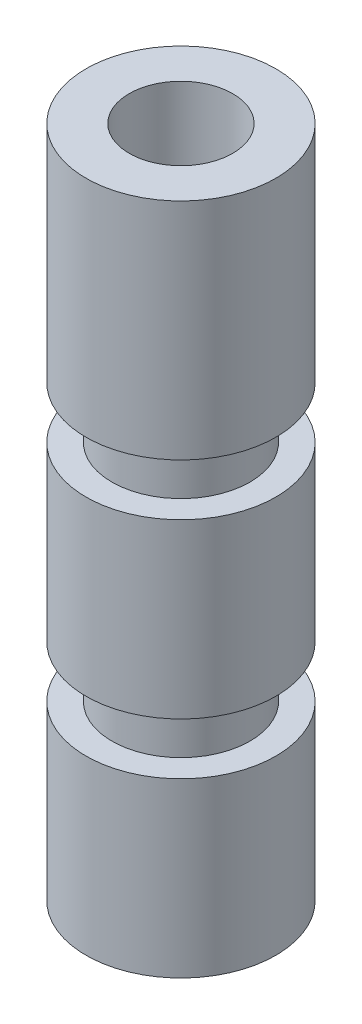
ISO-10303-21;
HEADER;
FILE_DESCRIPTION(('STEP AP214'),'2;1');
FILE_NAME('part.step','',(''),(''),'','','');
FILE_SCHEMA(('AUTOMOTIVE_DESIGN { 1 0 10303 214 1 1 1 1 }'));
ENDSEC;
DATA;
#1=APPLICATION_CONTEXT('core data for automotive mechanical design processes');
#2=APPLICATION_PROTOCOL_DEFINITION('international standard','automotive_design',2000,#1);
#3=PRODUCT_CONTEXT('',#1,'mechanical');
#4=PRODUCT('Part','Part','',(#3));
#5=PRODUCT_RELATED_PRODUCT_CATEGORY('part','',(#4));
#6=PRODUCT_DEFINITION_FORMATION('','',#4);
#7=PRODUCT_DEFINITION_CONTEXT('part definition',#1,'design');
#8=PRODUCT_DEFINITION('design','',#6,#7);
#9=PRODUCT_DEFINITION_SHAPE('','',#8);
#10=(LENGTH_UNIT() NAMED_UNIT(*) SI_UNIT(.MILLI.,.METRE.));
#11=(NAMED_UNIT(*) PLANE_ANGLE_UNIT() SI_UNIT($,.RADIAN.));
#12=(NAMED_UNIT(*) SI_UNIT($,.STERADIAN.) SOLID_ANGLE_UNIT());
#13=UNCERTAINTY_MEASURE_WITH_UNIT(LENGTH_MEASURE(1.E-05),#10,'distance_accuracy_value','');
#14=(GEOMETRIC_REPRESENTATION_CONTEXT(3) GLOBAL_UNCERTAINTY_ASSIGNED_CONTEXT((#13)) GLOBAL_UNIT_ASSIGNED_CONTEXT((#10,
#11,#12)) REPRESENTATION_CONTEXT('',''));
#15=CARTESIAN_POINT('',(0.,0.,0.));
#16=DIRECTION('',(0.,0.,1.));
#17=DIRECTION('',(1.,0.,0.));
#18=AXIS2_PLACEMENT_3D('',#15,#16,#17);
#19=CARTESIAN_POINT('',(0.,-6.5,0.));
#20=DIRECTION('',(0.,-1.,0.));
#21=DIRECTION('',(0.,0.,-1.));
#22=AXIS2_PLACEMENT_3D('',#19,#20,#21);
#23=PLANE('',#22);
#24=CARTESIAN_POINT('',(0.,-6.5,0.));
#25=DIRECTION('',(0.,-1.,0.));
#26=DIRECTION('',(0.,0.,-1.));
#27=AXIS2_PLACEMENT_3D('',#24,#25,#26);
#28=CIRCLE('',#27,2.75);
#29=CARTESIAN_POINT('',(0.,-6.5,-2.75));
#30=VERTEX_POINT('',#29);
#31=EDGE_CURVE('E65',#30,#30,#28,.T.);
#32=ORIENTED_EDGE('',*,*,#31,.T.);
#33=EDGE_LOOP('',(#32));
#34=FACE_BOUND('',#33,.T.);
#35=CARTESIAN_POINT('',(0.,-6.5,0.));
#36=DIRECTION('',(0.,-1.,0.));
#37=DIRECTION('',(0.,0.,-1.));
#38=AXIS2_PLACEMENT_3D('',#35,#36,#37);
#39=CIRCLE('',#38,2.);
#40=CARTESIAN_POINT('',(0.,-6.5,-2.));
#41=VERTEX_POINT('',#40);
#42=EDGE_CURVE('E74',#41,#41,#39,.T.);
#43=ORIENTED_EDGE('',*,*,#42,.F.);
#44=EDGE_LOOP('',(#43));
#45=FACE_BOUND('',#44,.T.);
#46=ADVANCED_FACE('F37',(#34,#45),#23,.T.);
#47=CARTESIAN_POINT('',(0.,0.,0.));
#48=DIRECTION('',(0.,1.,0.));
#49=DIRECTION('',(0.,0.,1.));
#50=AXIS2_PLACEMENT_3D('',#47,#48,#49);
#51=PLANE('',#50);
#52=CARTESIAN_POINT('',(0.,0.,0.));
#53=DIRECTION('',(0.,1.,0.));
#54=DIRECTION('',(0.,0.,1.));
#55=AXIS2_PLACEMENT_3D('',#52,#53,#54);
#56=CIRCLE('',#55,2.75);
#57=CARTESIAN_POINT('',(0.,0.,-2.75));
#58=VERTEX_POINT('',#57);
#59=EDGE_CURVE('E50',#58,#58,#56,.T.);
#60=ORIENTED_EDGE('',*,*,#59,.F.);
#61=EDGE_LOOP('',(#60));
#62=FACE_BOUND('',#61,.T.);
#63=CARTESIAN_POINT('',(0.,0.,0.));
#64=DIRECTION('',(0.,1.,0.));
#65=DIRECTION('',(0.,0.,1.));
#66=AXIS2_PLACEMENT_3D('',#63,#64,#65);
#67=CIRCLE('',#66,2.);
#68=CARTESIAN_POINT('',(0.,0.,2.));
#69=VERTEX_POINT('',#68);
#70=EDGE_CURVE('E10',#69,#69,#67,.F.);
#71=ORIENTED_EDGE('',*,*,#70,.F.);
#72=EDGE_LOOP('',(#71));
#73=FACE_BOUND('',#72,.T.);
#74=ADVANCED_FACE('F113',(#62,#73),#51,.F.);
#75=CARTESIAN_POINT('',(0.,6.5,0.));
#76=DIRECTION('',(0.,1.,0.));
#77=DIRECTION('',(0.,0.,1.));
#78=AXIS2_PLACEMENT_3D('',#75,#76,#77);
#79=PLANE('',#78);
#80=CARTESIAN_POINT('',(0.,6.5,0.));
#81=DIRECTION('',(0.,1.,0.));
#82=DIRECTION('',(0.,0.,1.));
#83=AXIS2_PLACEMENT_3D('',#80,#81,#82);
#84=CIRCLE('',#83,2.75);
#85=CARTESIAN_POINT('',(0.,6.5,-2.75));
#86=VERTEX_POINT('',#85);
#87=EDGE_CURVE('E45',#86,#86,#84,.T.);
#88=ORIENTED_EDGE('',*,*,#87,.T.);
#89=EDGE_LOOP('',(#88));
#90=FACE_BOUND('',#89,.T.);
#91=CARTESIAN_POINT('',(0.,6.5,0.));
#92=DIRECTION('',(0.,1.,0.));
#93=DIRECTION('',(0.,0.,1.));
#94=AXIS2_PLACEMENT_3D('',#91,#92,#93);
#95=CIRCLE('',#94,1.5);
#96=CARTESIAN_POINT('',(0.,6.5,-1.5));
#97=VERTEX_POINT('',#96);
#98=EDGE_CURVE('E56',#97,#97,#95,.T.);
#99=ORIENTED_EDGE('',*,*,#98,.F.);
#100=EDGE_LOOP('',(#99));
#101=FACE_BOUND('',#100,.T.);
#102=ADVANCED_FACE('F121',(#90,#101),#79,.T.);
#103=CARTESIAN_POINT('',(0.,6.5,0.));
#104=DIRECTION('',(0.,-1.,0.));
#105=DIRECTION('',(0.,0.,-1.));
#106=AXIS2_PLACEMENT_3D('',#103,#104,#105);
#107=CYLINDRICAL_SURFACE('',#106,2.75);
#108=CARTESIAN_POINT('',(0.,6.5,-2.75));
#109=CARTESIAN_POINT('',(0.,6.43229166666667,-2.75));
#110=CARTESIAN_POINT('',(0.,6.36458333333333,-2.75));
#111=CARTESIAN_POINT('',(0.,6.22916666666667,-2.75));
#112=CARTESIAN_POINT('',(0.,6.16145833333333,-2.75));
#113=CARTESIAN_POINT('',(0.,6.02604166666667,-2.75));
#114=CARTESIAN_POINT('',(0.,5.95833333333333,-2.75));
#115=CARTESIAN_POINT('',(0.,5.82291666666667,-2.75));
#116=CARTESIAN_POINT('',(0.,5.75520833333333,-2.75));
#117=CARTESIAN_POINT('',(0.,5.61979166666667,-2.75));
#118=CARTESIAN_POINT('',(0.,5.55208333333333,-2.75));
#119=CARTESIAN_POINT('',(0.,5.41666666666667,-2.75));
#120=CARTESIAN_POINT('',(0.,5.34895833333333,-2.75));
#121=CARTESIAN_POINT('',(0.,5.21354166666667,-2.75));
#122=CARTESIAN_POINT('',(0.,5.14583333333333,-2.75));
#123=CARTESIAN_POINT('',(0.,5.01041666666667,-2.75));
#124=CARTESIAN_POINT('',(0.,4.94270833333333,-2.75));
#125=CARTESIAN_POINT('',(0.,4.80729166666667,-2.75));
#126=CARTESIAN_POINT('',(0.,4.73958333333333,-2.75));
#127=CARTESIAN_POINT('',(0.,4.60416666666667,-2.75));
#128=CARTESIAN_POINT('',(0.,4.53645833333333,-2.75));
#129=CARTESIAN_POINT('',(0.,4.40104166666667,-2.75));
#130=CARTESIAN_POINT('',(0.,4.33333333333333,-2.75));
#131=CARTESIAN_POINT('',(0.,4.19791666666667,-2.75));
#132=CARTESIAN_POINT('',(0.,4.13020833333333,-2.75));
#133=CARTESIAN_POINT('',(0.,3.99479166666667,-2.75));
#134=CARTESIAN_POINT('',(0.,3.92708333333333,-2.75));
#135=CARTESIAN_POINT('',(0.,3.79166666666667,-2.75));
#136=CARTESIAN_POINT('',(0.,3.72395833333333,-2.75));
#137=CARTESIAN_POINT('',(0.,3.58854166666667,-2.75));
#138=CARTESIAN_POINT('',(0.,3.52083333333333,-2.75));
#139=CARTESIAN_POINT('',(0.,3.38541666666667,-2.75));
#140=CARTESIAN_POINT('',(0.,3.31770833333333,-2.75));
#141=CARTESIAN_POINT('',(0.,3.18229166666667,-2.75));
#142=CARTESIAN_POINT('',(0.,3.11458333333333,-2.75));
#143=CARTESIAN_POINT('',(0.,2.97916666666667,-2.75));
#144=CARTESIAN_POINT('',(0.,2.91145833333333,-2.75));
#145=CARTESIAN_POINT('',(0.,2.77604166666667,-2.75));
#146=CARTESIAN_POINT('',(0.,2.70833333333333,-2.75));
#147=CARTESIAN_POINT('',(0.,2.57291666666667,-2.75));
#148=CARTESIAN_POINT('',(0.,2.50520833333333,-2.75));
#149=CARTESIAN_POINT('',(0.,2.36979166666667,-2.75));
#150=CARTESIAN_POINT('',(0.,2.30208333333333,-2.75));
#151=CARTESIAN_POINT('',(0.,2.16666666666667,-2.75));
#152=CARTESIAN_POINT('',(0.,2.09895833333333,-2.75));
#153=CARTESIAN_POINT('',(0.,1.96354166666667,-2.75));
#154=CARTESIAN_POINT('',(0.,1.89583333333333,-2.75));
#155=CARTESIAN_POINT('',(0.,1.76041666666667,-2.75));
#156=CARTESIAN_POINT('',(0.,1.69270833333333,-2.75));
#157=CARTESIAN_POINT('',(0.,1.55729166666667,-2.75));
#158=CARTESIAN_POINT('',(0.,1.48958333333333,-2.75));
#159=CARTESIAN_POINT('',(0.,1.35416666666667,-2.75));
#160=CARTESIAN_POINT('',(0.,1.28645833333333,-2.75));
#161=CARTESIAN_POINT('',(0.,1.15104166666667,-2.75));
#162=CARTESIAN_POINT('',(0.,1.08333333333333,-2.75));
#163=CARTESIAN_POINT('',(0.,0.947916666666667,-2.75));
#164=CARTESIAN_POINT('',(0.,0.880208333333333,-2.75));
#165=CARTESIAN_POINT('',(0.,0.744791666666667,-2.75));
#166=CARTESIAN_POINT('',(0.,0.677083333333333,-2.75));
#167=CARTESIAN_POINT('',(0.,0.541666666666667,-2.75));
#168=CARTESIAN_POINT('',(0.,0.473958333333333,-2.75));
#169=CARTESIAN_POINT('',(0.,0.338541666666667,-2.75));
#170=CARTESIAN_POINT('',(0.,0.270833333333334,-2.75));
#171=CARTESIAN_POINT('',(0.,0.135416666666667,-2.75));
#172=CARTESIAN_POINT('',(0.,0.0677083333333334,-2.75));
#173=CARTESIAN_POINT('',(0.,0.,-2.75));
#174=B_SPLINE_CURVE_WITH_KNOTS('',3,(#108,#109,#110,#111,#112,#113,#114,#115,#116,#117,#118,
#119,#120,#121,#122,#123,#124,#125,#126,#127,#128,#129,#130,#131,#132,#133,#134,#135,#136,#137,
#138,#139,#140,#141,#142,#143,#144,#145,#146,#147,#148,#149,#150,#151,#152,#153,#154,#155,#156,
#157,#158,#159,#160,#161,#162,#163,#164,#165,#166,#167,#168,#169,#170,#171,#172,#173),
.UNSPECIFIED.,.F.,.F.,(4,2,2,2,2,2,2,2,2,2,2,2,2,2,2,2,2,2,2,2,2,2,2,2,2,2,2,2,2,2,2,2,4),(0.,
0.203125,0.40625,0.609375000000001,0.812500000000001,1.015625,1.21875,1.421875,1.625,1.828125,
2.03125,2.234375,2.4375,2.640625,2.84375,3.046875,3.25,3.453125,3.65625,3.859375,4.0625,
4.265625,4.46875,4.671875,4.875,5.078125,5.28125,5.484375,5.6875,5.890625,6.09375,6.296875,6.5),.UNSPECIFIED.);
#175=EDGE_CURVE('BSEAM39',#86,#58,#174,.T.);
#176=ORIENTED_EDGE('',*,*,#87,.F.);
#177=ORIENTED_EDGE('',*,*,#59,.T.);
#178=ORIENTED_EDGE('',*,*,#175,.T.);
#179=ORIENTED_EDGE('',*,*,#175,.F.);
#180=EDGE_LOOP('',(#176,#178,#177,#179));
#181=FACE_BOUND('',#180,.T.);
#182=ADVANCED_FACE('F39',(#181),#107,.T.);
#183=CARTESIAN_POINT('',(0.,6.5,0.));
#184=DIRECTION('',(0.,-1.,0.));
#185=DIRECTION('',(0.,0.,-1.));
#186=AXIS2_PLACEMENT_3D('',#183,#184,#185);
#187=CYLINDRICAL_SURFACE('',#186,1.5);
#188=CARTESIAN_POINT('',(0.,-13.,0.));
#189=DIRECTION('',(0.,-1.,0.));
#190=DIRECTION('',(0.,0.,-1.));
#191=AXIS2_PLACEMENT_3D('',#188,#189,#190);
#192=CIRCLE('',#191,1.5);
#193=CARTESIAN_POINT('',(0.,-13.,-1.5));
#194=VERTEX_POINT('',#193);
#195=EDGE_CURVE('E86',#194,#194,#192,.T.);
#196=CARTESIAN_POINT('',(0.,6.5,-1.5));
#197=CARTESIAN_POINT('',(0.,6.296875,-1.5));
#198=CARTESIAN_POINT('',(0.,6.09375,-1.5));
#199=CARTESIAN_POINT('',(0.,5.6875,-1.5));
#200=CARTESIAN_POINT('',(0.,5.484375,-1.5));
#201=CARTESIAN_POINT('',(0.,5.078125,-1.5));
#202=CARTESIAN_POINT('',(0.,4.875,-1.5));
#203=CARTESIAN_POINT('',(0.,4.46875,-1.5));
#204=CARTESIAN_POINT('',(0.,4.265625,-1.5));
#205=CARTESIAN_POINT('',(0.,3.859375,-1.5));
#206=CARTESIAN_POINT('',(0.,3.65625,-1.5));
#207=CARTESIAN_POINT('',(0.,3.25,-1.5));
#208=CARTESIAN_POINT('',(0.,3.046875,-1.5));
#209=CARTESIAN_POINT('',(0.,2.640625,-1.5));
#210=CARTESIAN_POINT('',(0.,2.4375,-1.5));
#211=CARTESIAN_POINT('',(0.,2.03125,-1.5));
#212=CARTESIAN_POINT('',(0.,1.828125,-1.5));
#213=CARTESIAN_POINT('',(0.,1.421875,-1.5));
#214=CARTESIAN_POINT('',(0.,1.21875,-1.5));
#215=CARTESIAN_POINT('',(0.,0.812499999999998,-1.5));
#216=CARTESIAN_POINT('',(0.,0.609374999999999,-1.5));
#217=CARTESIAN_POINT('',(0.,0.203124999999999,-1.5));
#218=CARTESIAN_POINT('',(0.,0.,-1.5));
#219=CARTESIAN_POINT('',(0.,-0.406250000000001,-1.5));
#220=CARTESIAN_POINT('',(0.,-0.609375000000001,-1.5));
#221=CARTESIAN_POINT('',(0.,-1.015625,-1.5));
#222=CARTESIAN_POINT('',(0.,-1.21875,-1.5));
#223=CARTESIAN_POINT('',(0.,-1.625,-1.5));
#224=CARTESIAN_POINT('',(0.,-1.828125,-1.5));
#225=CARTESIAN_POINT('',(0.,-2.234375,-1.5));
#226=CARTESIAN_POINT('',(0.,-2.4375,-1.5));
#227=CARTESIAN_POINT('',(0.,-2.84375,-1.5));
#228=CARTESIAN_POINT('',(0.,-3.046875,-1.5));
#229=CARTESIAN_POINT('',(0.,-3.453125,-1.5));
#230=CARTESIAN_POINT('',(0.,-3.65625,-1.5));
#231=CARTESIAN_POINT('',(0.,-4.0625,-1.5));
#232=CARTESIAN_POINT('',(0.,-4.265625,-1.5));
#233=CARTESIAN_POINT('',(0.,-4.671875,-1.5));
#234=CARTESIAN_POINT('',(0.,-4.875,-1.5));
#235=CARTESIAN_POINT('',(0.,-5.28125,-1.5));
#236=CARTESIAN_POINT('',(0.,-5.484375,-1.5));
#237=CARTESIAN_POINT('',(0.,-5.890625,-1.5));
#238=CARTESIAN_POINT('',(0.,-6.09375,-1.5));
#239=CARTESIAN_POINT('',(0.,-6.5,-1.5));
#240=CARTESIAN_POINT('',(0.,-6.703125,-1.5));
#241=CARTESIAN_POINT('',(0.,-7.109375,-1.5));
#242=CARTESIAN_POINT('',(0.,-7.3125,-1.5));
#243=CARTESIAN_POINT('',(0.,-7.71875,-1.5));
#244=CARTESIAN_POINT('',(0.,-7.921875,-1.5));
#245=CARTESIAN_POINT('',(0.,-8.328125,-1.5));
#246=CARTESIAN_POINT('',(0.,-8.53125,-1.5));
#247=CARTESIAN_POINT('',(0.,-8.9375,-1.5));
#248=CARTESIAN_POINT('',(0.,-9.140625,-1.5));
#249=CARTESIAN_POINT('',(0.,-9.546875,-1.5));
#250=CARTESIAN_POINT('',(0.,-9.75,-1.5));
#251=CARTESIAN_POINT('',(0.,-10.15625,-1.5));
#252=CARTESIAN_POINT('',(0.,-10.359375,-1.5));
#253=CARTESIAN_POINT('',(0.,-10.765625,-1.5));
#254=CARTESIAN_POINT('',(0.,-10.96875,-1.5));
#255=CARTESIAN_POINT('',(0.,-11.375,-1.5));
#256=CARTESIAN_POINT('',(0.,-11.578125,-1.5));
#257=CARTESIAN_POINT('',(0.,-11.984375,-1.5));
#258=CARTESIAN_POINT('',(0.,-12.1875,-1.5));
#259=CARTESIAN_POINT('',(0.,-12.59375,-1.5));
#260=CARTESIAN_POINT('',(0.,-12.796875,-1.5));
#261=CARTESIAN_POINT('',(0.,-13.,-1.5));
#262=B_SPLINE_CURVE_WITH_KNOTS('',3,(#196,#197,#198,#199,#200,#201,#202,#203,#204,#205,#206,
#207,#208,#209,#210,#211,#212,#213,#214,#215,#216,#217,#218,#219,#220,#221,#222,#223,#224,#225,
#226,#227,#228,#229,#230,#231,#232,#233,#234,#235,#236,#237,#238,#239,#240,#241,#242,#243,#244,
#245,#246,#247,#248,#249,#250,#251,#252,#253,#254,#255,#256,#257,#258,#259,#260,#261),
.UNSPECIFIED.,.F.,.F.,(4,2,2,2,2,2,2,2,2,2,2,2,2,2,2,2,2,2,2,2,2,2,2,2,2,2,2,2,2,2,2,2,4),(0.,
0.609375,1.21875,1.828125,2.4375,3.046875,3.65625,4.265625,4.875,5.484375,6.09375,6.703125,
7.3125,7.921875,8.53125,9.140625,9.75,10.359375,10.96875,11.578125,12.1875,12.796875,13.40625,
14.015625,14.625,15.234375,15.84375,16.453125,17.0625,17.671875,18.28125,18.890625,19.5),.UNSPECIFIED.);
#263=EDGE_CURVE('BSEAM94',#97,#194,#262,.T.);
#264=ORIENTED_EDGE('',*,*,#98,.T.);
#265=ORIENTED_EDGE('',*,*,#195,.T.);
#266=ORIENTED_EDGE('',*,*,#263,.T.);
#267=ORIENTED_EDGE('',*,*,#263,.F.);
#268=EDGE_LOOP('',(#264,#266,#265,#267));
#269=FACE_BOUND('',#268,.T.);
#270=ADVANCED_FACE('F94',(#269),#187,.F.);
#271=CARTESIAN_POINT('',(0.,-1.5,0.));
#272=DIRECTION('',(0.,1.,0.));
#273=DIRECTION('',(0.,0.,1.));
#274=AXIS2_PLACEMENT_3D('',#271,#272,#273);
#275=CYLINDRICAL_SURFACE('',#274,2.);
#276=CARTESIAN_POINT('',(0.,-1.5,0.));
#277=DIRECTION('',(0.,-1.,0.));
#278=DIRECTION('',(0.,0.,-1.));
#279=AXIS2_PLACEMENT_3D('',#276,#277,#278);
#280=CIRCLE('',#279,2.);
#281=CARTESIAN_POINT('',(0.,-1.5,-2.));
#282=VERTEX_POINT('',#281);
#283=EDGE_CURVE('E61',#282,#282,#280,.T.);
#284=ORIENTED_EDGE('',*,*,#283,.F.);
#285=EDGE_LOOP('',(#284));
#286=FACE_BOUND('',#285,.T.);
#287=ORIENTED_EDGE('',*,*,#70,.T.);
#288=EDGE_LOOP('',(#287));
#289=FACE_BOUND('',#288,.T.);
#290=ADVANCED_FACE('F129',(#286,#289),#275,.T.);
#291=CARTESIAN_POINT('',(0.,-1.5,0.));
#292=DIRECTION('',(0.,-1.,0.));
#293=DIRECTION('',(0.,0.,-1.));
#294=AXIS2_PLACEMENT_3D('',#291,#292,#293);
#295=PLANE('',#294);
#296=ORIENTED_EDGE('',*,*,#283,.T.);
#297=EDGE_LOOP('',(#296));
#298=FACE_BOUND('',#297,.T.);
#299=CARTESIAN_POINT('',(0.,-1.5,0.));
#300=DIRECTION('',(0.,-1.,0.));
#301=DIRECTION('',(0.,0.,-1.));
#302=AXIS2_PLACEMENT_3D('',#299,#300,#301);
#303=CIRCLE('',#302,2.75);
#304=CARTESIAN_POINT('',(0.,-1.5,-2.75));
#305=VERTEX_POINT('',#304);
#306=EDGE_CURVE('E66',#305,#305,#303,.T.);
#307=ORIENTED_EDGE('',*,*,#306,.F.);
#308=EDGE_LOOP('',(#307));
#309=FACE_BOUND('',#308,.T.);
#310=ADVANCED_FACE('F126',(#298,#309),#295,.F.);
#311=CARTESIAN_POINT('',(0.,-6.5,0.));
#312=DIRECTION('',(0.,1.,0.));
#313=DIRECTION('',(0.,0.,1.));
#314=AXIS2_PLACEMENT_3D('',#311,#312,#313);
#315=CYLINDRICAL_SURFACE('',#314,2.75);
#316=ORIENTED_EDGE('',*,*,#31,.F.);
#317=EDGE_LOOP('',(#316));
#318=FACE_BOUND('',#317,.T.);
#319=ORIENTED_EDGE('',*,*,#306,.T.);
#320=EDGE_LOOP('',(#319));
#321=FACE_BOUND('',#320,.T.);
#322=ADVANCED_FACE('F109',(#318,#321),#315,.T.);
#323=CARTESIAN_POINT('',(0.,-8.,0.));
#324=DIRECTION('',(0.,1.,0.));
#325=DIRECTION('',(0.,0.,1.));
#326=AXIS2_PLACEMENT_3D('',#323,#324,#325);
#327=CYLINDRICAL_SURFACE('',#326,2.);
#328=CARTESIAN_POINT('',(0.,-8.,0.));
#329=DIRECTION('',(0.,-1.,0.));
#330=DIRECTION('',(0.,0.,-1.));
#331=AXIS2_PLACEMENT_3D('',#328,#329,#330);
#332=CIRCLE('',#331,2.);
#333=CARTESIAN_POINT('',(0.,-8.,-2.));
#334=VERTEX_POINT('',#333);
#335=EDGE_CURVE('E70',#334,#334,#332,.T.);
#336=ORIENTED_EDGE('',*,*,#335,.F.);
#337=EDGE_LOOP('',(#336));
#338=FACE_BOUND('',#337,.T.);
#339=ORIENTED_EDGE('',*,*,#42,.T.);
#340=EDGE_LOOP('',(#339));
#341=FACE_BOUND('',#340,.T.);
#342=ADVANCED_FACE('F99',(#338,#341),#327,.T.);
#343=CARTESIAN_POINT('',(0.,-13.,0.));
#344=DIRECTION('',(0.,-1.,0.));
#345=DIRECTION('',(0.,0.,-1.));
#346=AXIS2_PLACEMENT_3D('',#343,#344,#345);
#347=PLANE('',#346);
#348=CARTESIAN_POINT('',(0.,-13.,0.));
#349=DIRECTION('',(0.,-1.,0.));
#350=DIRECTION('',(0.,0.,-1.));
#351=AXIS2_PLACEMENT_3D('',#348,#349,#350);
#352=CIRCLE('',#351,2.75);
#353=CARTESIAN_POINT('',(0.,-13.,-2.75));
#354=VERTEX_POINT('',#353);
#355=EDGE_CURVE('E78',#354,#354,#352,.T.);
#356=ORIENTED_EDGE('',*,*,#355,.T.);
#357=EDGE_LOOP('',(#356));
#358=FACE_BOUND('',#357,.T.);
#359=ORIENTED_EDGE('',*,*,#195,.F.);
#360=EDGE_LOOP('',(#359));
#361=FACE_BOUND('',#360,.T.);
#362=ADVANCED_FACE('F96',(#358,#361),#347,.T.);
#363=CARTESIAN_POINT('',(0.,-8.,0.));
#364=DIRECTION('',(0.,-1.,0.));
#365=DIRECTION('',(0.,0.,-1.));
#366=AXIS2_PLACEMENT_3D('',#363,#364,#365);
#367=PLANE('',#366);
#368=ORIENTED_EDGE('',*,*,#335,.T.);
#369=EDGE_LOOP('',(#368));
#370=FACE_BOUND('',#369,.T.);
#371=CARTESIAN_POINT('',(0.,-8.,0.));
#372=DIRECTION('',(0.,-1.,0.));
#373=DIRECTION('',(0.,0.,-1.));
#374=AXIS2_PLACEMENT_3D('',#371,#372,#373);
#375=CIRCLE('',#374,2.75);
#376=CARTESIAN_POINT('',(0.,-8.,-2.75));
#377=VERTEX_POINT('',#376);
#378=EDGE_CURVE('E82',#377,#377,#375,.T.);
#379=ORIENTED_EDGE('',*,*,#378,.F.);
#380=EDGE_LOOP('',(#379));
#381=FACE_BOUND('',#380,.T.);
#382=ADVANCED_FACE('F98',(#370,#381),#367,.F.);
#383=CARTESIAN_POINT('',(0.,-13.,0.));
#384=DIRECTION('',(0.,1.,0.));
#385=DIRECTION('',(0.,0.,1.));
#386=AXIS2_PLACEMENT_3D('',#383,#384,#385);
#387=CYLINDRICAL_SURFACE('',#386,2.75);
#388=ORIENTED_EDGE('',*,*,#355,.F.);
#389=EDGE_LOOP('',(#388));
#390=FACE_BOUND('',#389,.T.);
#391=ORIENTED_EDGE('',*,*,#378,.T.);
#392=EDGE_LOOP('',(#391));
#393=FACE_BOUND('',#392,.T.);
#394=ADVANCED_FACE('F106',(#390,#393),#387,.T.);
#395=CLOSED_SHELL('',(#46,#74,#102,#182,#270,#290,#310,#322,#342,#362,#382,#394));
#396=MANIFOLD_SOLID_BREP('B2',#395);
#397=ADVANCED_BREP_SHAPE_REPRESENTATION('',(#18,#396),#14);
#398=SHAPE_DEFINITION_REPRESENTATION(#9,#397);
ENDSEC;
END-ISO-10303-21;
